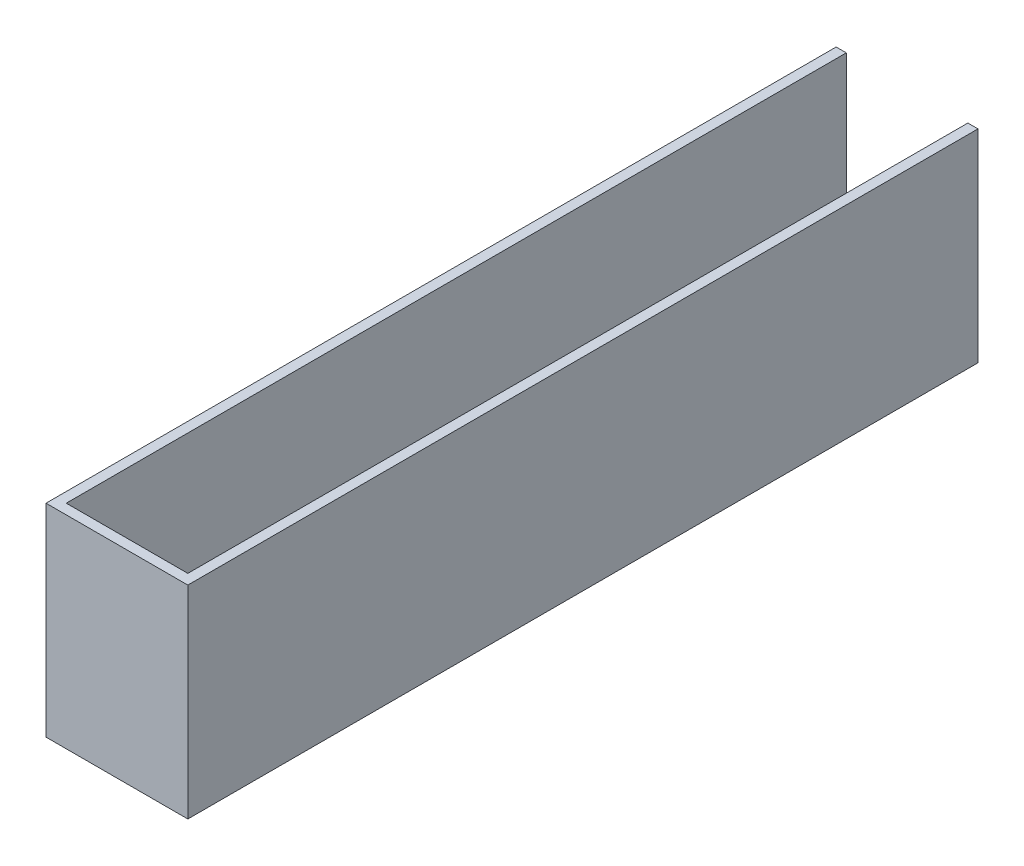
ISO-10303-21;
HEADER;
FILE_DESCRIPTION(('STEP AP214'),'2;1');
FILE_NAME('part.step','',(''),(''),'','','');
FILE_SCHEMA(('AUTOMOTIVE_DESIGN { 1 0 10303 214 1 1 1 1 }'));
ENDSEC;
DATA;
#1=APPLICATION_CONTEXT('core data for automotive mechanical design processes');
#2=APPLICATION_PROTOCOL_DEFINITION('international standard','automotive_design',2000,#1);
#3=PRODUCT_CONTEXT('',#1,'mechanical');
#4=PRODUCT('Part','Part','',(#3));
#5=PRODUCT_RELATED_PRODUCT_CATEGORY('part','',(#4));
#6=PRODUCT_DEFINITION_FORMATION('','',#4);
#7=PRODUCT_DEFINITION_CONTEXT('part definition',#1,'design');
#8=PRODUCT_DEFINITION('design','',#6,#7);
#9=PRODUCT_DEFINITION_SHAPE('','',#8);
#10=(LENGTH_UNIT() NAMED_UNIT(*) SI_UNIT(.MILLI.,.METRE.));
#11=(NAMED_UNIT(*) PLANE_ANGLE_UNIT() SI_UNIT($,.RADIAN.));
#12=(NAMED_UNIT(*) SI_UNIT($,.STERADIAN.) SOLID_ANGLE_UNIT());
#13=UNCERTAINTY_MEASURE_WITH_UNIT(LENGTH_MEASURE(1.E-05),#10,'distance_accuracy_value','');
#14=(GEOMETRIC_REPRESENTATION_CONTEXT(3) GLOBAL_UNCERTAINTY_ASSIGNED_CONTEXT((#13)) GLOBAL_UNIT_ASSIGNED_CONTEXT((#10,
#11,#12)) REPRESENTATION_CONTEXT('',''));
#15=CARTESIAN_POINT('',(0.,0.,0.));
#16=DIRECTION('',(0.,0.,1.));
#17=DIRECTION('',(1.,0.,0.));
#18=AXIS2_PLACEMENT_3D('',#15,#16,#17);
#19=CARTESIAN_POINT('',(-140.,200.,0.));
#20=DIRECTION('',(0.,0.,-1.));
#21=DIRECTION('',(-1.,0.,0.));
#22=AXIS2_PLACEMENT_3D('',#19,#20,#21);
#23=PLANE('',#22);
#24=DIRECTION('',(1.,0.,0.));
#25=VECTOR('',#24,1.);
#26=CARTESIAN_POINT('',(-140.,0.,0.));
#27=LINE('',#26,#25);
#28=CARTESIAN_POINT('',(-140.,0.,0.));
#29=VERTEX_POINT('',#28);
#30=CARTESIAN_POINT('',(0.,0.,0.));
#31=VERTEX_POINT('',#30);
#32=EDGE_CURVE('E140',#29,#31,#27,.T.);
#33=ORIENTED_EDGE('',*,*,#32,.T.);
#34=DIRECTION('',(0.,-1.,0.));
#35=VECTOR('',#34,1.);
#36=CARTESIAN_POINT('',(0.,200.,0.));
#37=LINE('',#36,#35);
#38=CARTESIAN_POINT('',(0.,200.,0.));
#39=VERTEX_POINT('',#38);
#40=EDGE_CURVE('E11',#39,#31,#37,.T.);
#41=ORIENTED_EDGE('',*,*,#40,.F.);
#42=DIRECTION('',(1.,0.,0.));
#43=VECTOR('',#42,1.);
#44=CARTESIAN_POINT('',(-140.,200.,0.));
#45=LINE('',#44,#43);
#46=CARTESIAN_POINT('',(-140.,200.,0.));
#47=VERTEX_POINT('',#46);
#48=EDGE_CURVE('E162',#47,#39,#45,.T.);
#49=ORIENTED_EDGE('',*,*,#48,.F.);
#50=DIRECTION('',(0.,-1.,0.));
#51=VECTOR('',#50,1.);
#52=CARTESIAN_POINT('',(-140.,200.,0.));
#53=LINE('',#52,#51);
#54=EDGE_CURVE('E136',#47,#29,#53,.T.);
#55=ORIENTED_EDGE('',*,*,#54,.T.);
#56=EDGE_LOOP('',(#33,#41,#49,#55));
#57=FACE_BOUND('',#56,.T.);
#58=ADVANCED_FACE('F39',(#57),#23,.F.);
#59=CARTESIAN_POINT('',(0.,200.,0.));
#60=DIRECTION('',(-1.,0.,0.));
#61=DIRECTION('',(0.,0.,1.));
#62=AXIS2_PLACEMENT_3D('',#59,#60,#61);
#63=PLANE('',#62);
#64=DIRECTION('',(0.,0.,-1.));
#65=VECTOR('',#64,1.);
#66=CARTESIAN_POINT('',(0.,0.,0.));
#67=LINE('',#66,#65);
#68=CARTESIAN_POINT('',(0.,0.,-780.));
#69=VERTEX_POINT('',#68);
#70=EDGE_CURVE('E144',#31,#69,#67,.T.);
#71=ORIENTED_EDGE('',*,*,#70,.T.);
#72=DIRECTION('',(0.,-1.,0.));
#73=VECTOR('',#72,1.);
#74=CARTESIAN_POINT('',(0.,200.,-780.));
#75=LINE('',#74,#73);
#76=CARTESIAN_POINT('',(0.,200.,-780.));
#77=VERTEX_POINT('',#76);
#78=EDGE_CURVE('E48',#77,#69,#75,.T.);
#79=ORIENTED_EDGE('',*,*,#78,.F.);
#80=DIRECTION('',(0.,0.,-1.));
#81=VECTOR('',#80,1.);
#82=CARTESIAN_POINT('',(0.,200.,0.));
#83=LINE('',#82,#81);
#84=EDGE_CURVE('E99',#39,#77,#83,.T.);
#85=ORIENTED_EDGE('',*,*,#84,.F.);
#86=ORIENTED_EDGE('',*,*,#40,.T.);
#87=EDGE_LOOP('',(#71,#79,#85,#86));
#88=FACE_BOUND('',#87,.T.);
#89=ADVANCED_FACE('F208',(#88),#63,.F.);
#90=CARTESIAN_POINT('',(0.,200.,-780.));
#91=DIRECTION('',(0.,0.,1.));
#92=DIRECTION('',(1.,0.,0.));
#93=AXIS2_PLACEMENT_3D('',#90,#91,#92);
#94=PLANE('',#93);
#95=DIRECTION('',(-1.,0.,0.));
#96=VECTOR('',#95,1.);
#97=CARTESIAN_POINT('',(0.,0.,-780.));
#98=LINE('',#97,#96);
#99=CARTESIAN_POINT('',(-10.,0.,-780.));
#100=VERTEX_POINT('',#99);
#101=EDGE_CURVE('E147',#69,#100,#98,.T.);
#102=ORIENTED_EDGE('',*,*,#101,.T.);
#103=DIRECTION('',(0.,-1.,0.));
#104=VECTOR('',#103,1.);
#105=CARTESIAN_POINT('',(-10.,200.,-780.));
#106=LINE('',#105,#104);
#107=CARTESIAN_POINT('',(-10.,200.,-780.));
#108=VERTEX_POINT('',#107);
#109=EDGE_CURVE('E173',#108,#100,#106,.T.);
#110=ORIENTED_EDGE('',*,*,#109,.F.);
#111=DIRECTION('',(-1.,0.,0.));
#112=VECTOR('',#111,1.);
#113=CARTESIAN_POINT('',(0.,200.,-780.));
#114=LINE('',#113,#112);
#115=EDGE_CURVE('E183',#77,#108,#114,.T.);
#116=ORIENTED_EDGE('',*,*,#115,.F.);
#117=ORIENTED_EDGE('',*,*,#78,.T.);
#118=EDGE_LOOP('',(#102,#110,#116,#117));
#119=FACE_BOUND('',#118,.T.);
#120=ADVANCED_FACE('F181',(#119),#94,.F.);
#121=CARTESIAN_POINT('',(-10.,200.,-780.));
#122=DIRECTION('',(1.,0.,0.));
#123=DIRECTION('',(0.,0.,-1.));
#124=AXIS2_PLACEMENT_3D('',#121,#122,#123);
#125=PLANE('',#124);
#126=DIRECTION('',(0.,0.,1.));
#127=VECTOR('',#126,1.);
#128=CARTESIAN_POINT('',(-10.,0.,-780.));
#129=LINE('',#128,#127);
#130=CARTESIAN_POINT('',(-9.9999999999999,0.,-10.));
#131=VERTEX_POINT('',#130);
#132=EDGE_CURVE('E150',#100,#131,#129,.T.);
#133=ORIENTED_EDGE('',*,*,#132,.T.);
#134=DIRECTION('',(0.,-1.,0.));
#135=VECTOR('',#134,1.);
#136=CARTESIAN_POINT('',(-9.9999999999999,200.,-10.));
#137=LINE('',#136,#135);
#138=CARTESIAN_POINT('',(-9.9999999999999,200.,-10.));
#139=VERTEX_POINT('',#138);
#140=EDGE_CURVE('E169',#139,#131,#137,.T.);
#141=ORIENTED_EDGE('',*,*,#140,.F.);
#142=DIRECTION('',(0.,0.,1.));
#143=VECTOR('',#142,1.);
#144=CARTESIAN_POINT('',(-10.,200.,-780.));
#145=LINE('',#144,#143);
#146=EDGE_CURVE('E196',#108,#139,#145,.T.);
#147=ORIENTED_EDGE('',*,*,#146,.F.);
#148=ORIENTED_EDGE('',*,*,#109,.T.);
#149=EDGE_LOOP('',(#133,#141,#147,#148));
#150=FACE_BOUND('',#149,.T.);
#151=ADVANCED_FACE('F191',(#150),#125,.F.);
#152=CARTESIAN_POINT('',(-9.9999999999999,200.,-10.));
#153=DIRECTION('',(0.,0.,1.));
#154=DIRECTION('',(1.,0.,0.));
#155=AXIS2_PLACEMENT_3D('',#152,#153,#154);
#156=PLANE('',#155);
#157=DIRECTION('',(-1.,0.,0.));
#158=VECTOR('',#157,1.);
#159=CARTESIAN_POINT('',(-9.9999999999999,0.,-10.));
#160=LINE('',#159,#158);
#161=CARTESIAN_POINT('',(-130.,0.,-9.99999999999998));
#162=VERTEX_POINT('',#161);
#163=EDGE_CURVE('E153',#131,#162,#160,.T.);
#164=ORIENTED_EDGE('',*,*,#163,.T.);
#165=DIRECTION('',(0.,-1.,0.));
#166=VECTOR('',#165,1.);
#167=CARTESIAN_POINT('',(-130.,200.,-9.99999999999998));
#168=LINE('',#167,#166);
#169=CARTESIAN_POINT('',(-130.,200.,-9.99999999999998));
#170=VERTEX_POINT('',#169);
#171=EDGE_CURVE('E129',#170,#162,#168,.T.);
#172=ORIENTED_EDGE('',*,*,#171,.F.);
#173=DIRECTION('',(-1.,0.,0.));
#174=VECTOR('',#173,1.);
#175=CARTESIAN_POINT('',(-9.9999999999999,200.,-10.));
#176=LINE('',#175,#174);
#177=EDGE_CURVE('E118',#139,#170,#176,.T.);
#178=ORIENTED_EDGE('',*,*,#177,.F.);
#179=ORIENTED_EDGE('',*,*,#140,.T.);
#180=EDGE_LOOP('',(#164,#172,#178,#179));
#181=FACE_BOUND('',#180,.T.);
#182=ADVANCED_FACE('F194',(#181),#156,.F.);
#183=CARTESIAN_POINT('',(-130.,200.,-9.99999999999998));
#184=DIRECTION('',(-1.,0.,0.));
#185=DIRECTION('',(0.,0.,1.));
#186=AXIS2_PLACEMENT_3D('',#183,#184,#185);
#187=PLANE('',#186);
#188=DIRECTION('',(0.,0.,-1.));
#189=VECTOR('',#188,1.);
#190=CARTESIAN_POINT('',(-130.,0.,-9.99999999999998));
#191=LINE('',#190,#189);
#192=CARTESIAN_POINT('',(-130.,0.,-780.));
#193=VERTEX_POINT('',#192);
#194=EDGE_CURVE('E127',#162,#193,#191,.T.);
#195=ORIENTED_EDGE('',*,*,#194,.T.);
#196=DIRECTION('',(0.,-1.,0.));
#197=VECTOR('',#196,1.);
#198=CARTESIAN_POINT('',(-130.,200.,-780.));
#199=LINE('',#198,#197);
#200=CARTESIAN_POINT('',(-130.,200.,-780.));
#201=VERTEX_POINT('',#200);
#202=EDGE_CURVE('E124',#201,#193,#199,.T.);
#203=ORIENTED_EDGE('',*,*,#202,.F.);
#204=DIRECTION('',(0.,0.,-1.));
#205=VECTOR('',#204,1.);
#206=CARTESIAN_POINT('',(-130.,200.,-9.99999999999998));
#207=LINE('',#206,#205);
#208=EDGE_CURVE('E112',#170,#201,#207,.T.);
#209=ORIENTED_EDGE('',*,*,#208,.F.);
#210=ORIENTED_EDGE('',*,*,#171,.T.);
#211=EDGE_LOOP('',(#195,#203,#209,#210));
#212=FACE_BOUND('',#211,.T.);
#213=ADVANCED_FACE('F125',(#212),#187,.F.);
#214=CARTESIAN_POINT('',(-130.,200.,-780.));
#215=DIRECTION('',(0.,0.,1.));
#216=DIRECTION('',(1.,0.,0.));
#217=AXIS2_PLACEMENT_3D('',#214,#215,#216);
#218=PLANE('',#217);
#219=DIRECTION('',(-1.,0.,0.));
#220=VECTOR('',#219,1.);
#221=CARTESIAN_POINT('',(-130.,0.,-780.));
#222=LINE('',#221,#220);
#223=CARTESIAN_POINT('',(-140.,0.,-780.));
#224=VERTEX_POINT('',#223);
#225=EDGE_CURVE('E85',#193,#224,#222,.T.);
#226=ORIENTED_EDGE('',*,*,#225,.T.);
#227=DIRECTION('',(0.,-1.,0.));
#228=VECTOR('',#227,1.);
#229=CARTESIAN_POINT('',(-140.,200.,-780.));
#230=LINE('',#229,#228);
#231=CARTESIAN_POINT('',(-140.,200.,-780.));
#232=VERTEX_POINT('',#231);
#233=EDGE_CURVE('E130',#232,#224,#230,.T.);
#234=ORIENTED_EDGE('',*,*,#233,.F.);
#235=DIRECTION('',(-1.,0.,0.));
#236=VECTOR('',#235,1.);
#237=CARTESIAN_POINT('',(-130.,200.,-780.));
#238=LINE('',#237,#236);
#239=EDGE_CURVE('E116',#201,#232,#238,.T.);
#240=ORIENTED_EDGE('',*,*,#239,.F.);
#241=ORIENTED_EDGE('',*,*,#202,.T.);
#242=EDGE_LOOP('',(#226,#234,#240,#241));
#243=FACE_BOUND('',#242,.T.);
#244=ADVANCED_FACE('F132',(#243),#218,.F.);
#245=CARTESIAN_POINT('',(-140.,200.,-780.));
#246=DIRECTION('',(1.,0.,0.));
#247=DIRECTION('',(0.,0.,-1.));
#248=AXIS2_PLACEMENT_3D('',#245,#246,#247);
#249=PLANE('',#248);
#250=DIRECTION('',(0.,0.,1.));
#251=VECTOR('',#250,1.);
#252=CARTESIAN_POINT('',(-140.,0.,-780.));
#253=LINE('',#252,#251);
#254=EDGE_CURVE('E91',#224,#29,#253,.T.);
#255=ORIENTED_EDGE('',*,*,#254,.T.);
#256=ORIENTED_EDGE('',*,*,#54,.F.);
#257=DIRECTION('',(0.,0.,1.));
#258=VECTOR('',#257,1.);
#259=CARTESIAN_POINT('',(-140.,200.,-780.));
#260=LINE('',#259,#258);
#261=EDGE_CURVE('E56',#232,#47,#260,.T.);
#262=ORIENTED_EDGE('',*,*,#261,.F.);
#263=ORIENTED_EDGE('',*,*,#233,.T.);
#264=EDGE_LOOP('',(#255,#256,#262,#263));
#265=FACE_BOUND('',#264,.T.);
#266=ADVANCED_FACE('F224',(#265),#249,.F.);
#267=CARTESIAN_POINT('',(0.,200.,0.));
#268=DIRECTION('',(0.,1.,0.));
#269=DIRECTION('',(0.,0.,1.));
#270=AXIS2_PLACEMENT_3D('',#267,#268,#269);
#271=PLANE('',#270);
#272=ORIENTED_EDGE('',*,*,#48,.T.);
#273=ORIENTED_EDGE('',*,*,#84,.T.);
#274=ORIENTED_EDGE('',*,*,#115,.T.);
#275=ORIENTED_EDGE('',*,*,#146,.T.);
#276=ORIENTED_EDGE('',*,*,#177,.T.);
#277=ORIENTED_EDGE('',*,*,#208,.T.);
#278=ORIENTED_EDGE('',*,*,#239,.T.);
#279=ORIENTED_EDGE('',*,*,#261,.T.);
#280=EDGE_LOOP('',(#272,#273,#274,#275,#276,#277,#278,#279));
#281=FACE_BOUND('',#280,.T.);
#282=ADVANCED_FACE('F114',(#281),#271,.T.);
#283=CARTESIAN_POINT('',(0.,0.,0.));
#284=DIRECTION('',(0.,1.,0.));
#285=DIRECTION('',(0.,0.,1.));
#286=AXIS2_PLACEMENT_3D('',#283,#284,#285);
#287=PLANE('',#286);
#288=ORIENTED_EDGE('',*,*,#32,.F.);
#289=ORIENTED_EDGE('',*,*,#254,.F.);
#290=ORIENTED_EDGE('',*,*,#225,.F.);
#291=ORIENTED_EDGE('',*,*,#194,.F.);
#292=ORIENTED_EDGE('',*,*,#163,.F.);
#293=ORIENTED_EDGE('',*,*,#132,.F.);
#294=ORIENTED_EDGE('',*,*,#101,.F.);
#295=ORIENTED_EDGE('',*,*,#70,.F.);
#296=EDGE_LOOP('',(#288,#289,#290,#291,#292,#293,#294,#295));
#297=FACE_BOUND('',#296,.T.);
#298=ADVANCED_FACE('F187',(#297),#287,.F.);
#299=CLOSED_SHELL('',(#58,#89,#120,#151,#182,#213,#244,#266,#282,#298));
#300=MANIFOLD_SOLID_BREP('B2',#299);
#301=ADVANCED_BREP_SHAPE_REPRESENTATION('',(#18,#300),#14);
#302=SHAPE_DEFINITION_REPRESENTATION(#9,#301);
ENDSEC;
END-ISO-10303-21;
